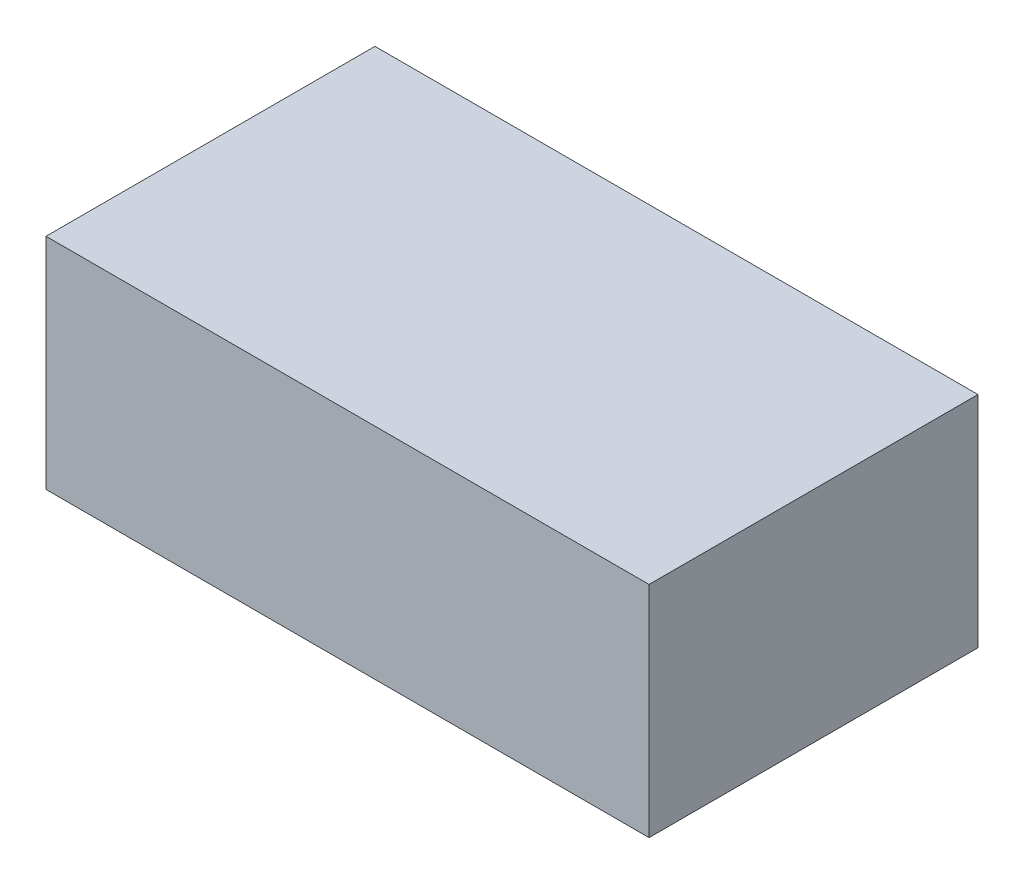
ISO-10303-21;
HEADER;
FILE_DESCRIPTION(('STEP AP214'),'2;1');
FILE_NAME('part.step','',(''),(''),'','','');
FILE_SCHEMA(('AUTOMOTIVE_DESIGN { 1 0 10303 214 1 1 1 1 }'));
ENDSEC;
DATA;
#1=APPLICATION_CONTEXT('core data for automotive mechanical design processes');
#2=APPLICATION_PROTOCOL_DEFINITION('international standard','automotive_design',2000,#1);
#3=PRODUCT_CONTEXT('',#1,'mechanical');
#4=PRODUCT('Part','Part','',(#3));
#5=PRODUCT_RELATED_PRODUCT_CATEGORY('part','',(#4));
#6=PRODUCT_DEFINITION_FORMATION('','',#4);
#7=PRODUCT_DEFINITION_CONTEXT('part definition',#1,'design');
#8=PRODUCT_DEFINITION('design','',#6,#7);
#9=PRODUCT_DEFINITION_SHAPE('','',#8);
#10=(LENGTH_UNIT() NAMED_UNIT(*) SI_UNIT(.MILLI.,.METRE.));
#11=(NAMED_UNIT(*) PLANE_ANGLE_UNIT() SI_UNIT($,.RADIAN.));
#12=(NAMED_UNIT(*) SI_UNIT($,.STERADIAN.) SOLID_ANGLE_UNIT());
#13=UNCERTAINTY_MEASURE_WITH_UNIT(LENGTH_MEASURE(1.E-05),#10,'distance_accuracy_value','');
#14=(GEOMETRIC_REPRESENTATION_CONTEXT(3) GLOBAL_UNCERTAINTY_ASSIGNED_CONTEXT((#13)) GLOBAL_UNIT_ASSIGNED_CONTEXT((#10,
#11,#12)) REPRESENTATION_CONTEXT('',''));
#15=CARTESIAN_POINT('',(0.,0.,0.));
#16=DIRECTION('',(0.,0.,1.));
#17=DIRECTION('',(1.,0.,0.));
#18=AXIS2_PLACEMENT_3D('',#15,#16,#17);
#19=CARTESIAN_POINT('',(275.,0.,0.));
#20=DIRECTION('',(0.,0.,1.));
#21=DIRECTION('',(1.,0.,0.));
#22=AXIS2_PLACEMENT_3D('',#19,#20,#21);
#23=PLANE('',#22);
#24=DIRECTION('',(0.,1.,0.));
#25=VECTOR('',#24,1.);
#26=CARTESIAN_POINT('',(0.,0.,0.));
#27=LINE('',#26,#25);
#28=CARTESIAN_POINT('',(0.,0.,0.));
#29=VERTEX_POINT('',#28);
#30=CARTESIAN_POINT('',(0.,100.,0.));
#31=VERTEX_POINT('',#30);
#32=EDGE_CURVE('E99',#29,#31,#27,.T.);
#33=ORIENTED_EDGE('',*,*,#32,.T.);
#34=DIRECTION('',(-1.,0.,0.));
#35=VECTOR('',#34,1.);
#36=CARTESIAN_POINT('',(275.,100.,0.));
#37=LINE('',#36,#35);
#38=CARTESIAN_POINT('',(275.,100.,0.));
#39=VERTEX_POINT('',#38);
#40=EDGE_CURVE('E11',#39,#31,#37,.T.);
#41=ORIENTED_EDGE('',*,*,#40,.F.);
#42=DIRECTION('',(0.,1.,0.));
#43=VECTOR('',#42,1.);
#44=CARTESIAN_POINT('',(275.,0.,0.));
#45=LINE('',#44,#43);
#46=CARTESIAN_POINT('',(275.,0.,0.));
#47=VERTEX_POINT('',#46);
#48=EDGE_CURVE('E87',#47,#39,#45,.T.);
#49=ORIENTED_EDGE('',*,*,#48,.F.);
#50=DIRECTION('',(-1.,0.,0.));
#51=VECTOR('',#50,1.);
#52=CARTESIAN_POINT('',(275.,0.,0.));
#53=LINE('',#52,#51);
#54=EDGE_CURVE('E95',#47,#29,#53,.T.);
#55=ORIENTED_EDGE('',*,*,#54,.T.);
#56=EDGE_LOOP('',(#33,#41,#49,#55));
#57=FACE_BOUND('',#56,.T.);
#58=ADVANCED_FACE('F36',(#57),#23,.F.);
#59=CARTESIAN_POINT('',(275.,100.,0.));
#60=DIRECTION('',(0.,-1.,0.));
#61=DIRECTION('',(0.,0.,-1.));
#62=AXIS2_PLACEMENT_3D('',#59,#60,#61);
#63=PLANE('',#62);
#64=DIRECTION('',(0.,0.,1.));
#65=VECTOR('',#64,1.);
#66=CARTESIAN_POINT('',(0.,100.,0.));
#67=LINE('',#66,#65);
#68=CARTESIAN_POINT('',(0.,100.,150.));
#69=VERTEX_POINT('',#68);
#70=EDGE_CURVE('E91',#31,#69,#67,.T.);
#71=ORIENTED_EDGE('',*,*,#70,.T.);
#72=DIRECTION('',(-1.,0.,0.));
#73=VECTOR('',#72,1.);
#74=CARTESIAN_POINT('',(275.,100.,150.));
#75=LINE('',#74,#73);
#76=CARTESIAN_POINT('',(275.,100.,150.));
#77=VERTEX_POINT('',#76);
#78=EDGE_CURVE('E44',#77,#69,#75,.T.);
#79=ORIENTED_EDGE('',*,*,#78,.F.);
#80=DIRECTION('',(0.,0.,1.));
#81=VECTOR('',#80,1.);
#82=CARTESIAN_POINT('',(275.,100.,0.));
#83=LINE('',#82,#81);
#84=EDGE_CURVE('E82',#39,#77,#83,.T.);
#85=ORIENTED_EDGE('',*,*,#84,.F.);
#86=ORIENTED_EDGE('',*,*,#40,.T.);
#87=EDGE_LOOP('',(#71,#79,#85,#86));
#88=FACE_BOUND('',#87,.T.);
#89=ADVANCED_FACE('F90',(#88),#63,.F.);
#90=CARTESIAN_POINT('',(275.,0.,150.));
#91=DIRECTION('',(0.,0.,-1.));
#92=DIRECTION('',(-1.,0.,0.));
#93=AXIS2_PLACEMENT_3D('',#90,#91,#92);
#94=PLANE('',#93);
#95=DIRECTION('',(0.,-1.,0.));
#96=VECTOR('',#95,1.);
#97=CARTESIAN_POINT('',(0.,0.,150.));
#98=LINE('',#97,#96);
#99=CARTESIAN_POINT('',(0.,0.,150.));
#100=VERTEX_POINT('',#99);
#101=EDGE_CURVE('E69',#69,#100,#98,.T.);
#102=ORIENTED_EDGE('',*,*,#101,.T.);
#103=DIRECTION('',(-1.,0.,0.));
#104=VECTOR('',#103,1.);
#105=CARTESIAN_POINT('',(275.,0.,150.));
#106=LINE('',#105,#104);
#107=CARTESIAN_POINT('',(275.,0.,150.));
#108=VERTEX_POINT('',#107);
#109=EDGE_CURVE('E92',#108,#100,#106,.T.);
#110=ORIENTED_EDGE('',*,*,#109,.F.);
#111=DIRECTION('',(0.,-1.,0.));
#112=VECTOR('',#111,1.);
#113=CARTESIAN_POINT('',(275.,0.,150.));
#114=LINE('',#113,#112);
#115=EDGE_CURVE('E85',#77,#108,#114,.T.);
#116=ORIENTED_EDGE('',*,*,#115,.F.);
#117=ORIENTED_EDGE('',*,*,#78,.T.);
#118=EDGE_LOOP('',(#102,#110,#116,#117));
#119=FACE_BOUND('',#118,.T.);
#120=ADVANCED_FACE('F93',(#119),#94,.F.);
#121=CARTESIAN_POINT('',(275.,0.,0.));
#122=DIRECTION('',(0.,1.,0.));
#123=DIRECTION('',(0.,0.,1.));
#124=AXIS2_PLACEMENT_3D('',#121,#122,#123);
#125=PLANE('',#124);
#126=DIRECTION('',(0.,0.,-1.));
#127=VECTOR('',#126,1.);
#128=CARTESIAN_POINT('',(0.,0.,0.));
#129=LINE('',#128,#127);
#130=EDGE_CURVE('E75',#100,#29,#129,.T.);
#131=ORIENTED_EDGE('',*,*,#130,.T.);
#132=ORIENTED_EDGE('',*,*,#54,.F.);
#133=DIRECTION('',(0.,0.,-1.));
#134=VECTOR('',#133,1.);
#135=CARTESIAN_POINT('',(275.,0.,0.));
#136=LINE('',#135,#134);
#137=EDGE_CURVE('E52',#108,#47,#136,.T.);
#138=ORIENTED_EDGE('',*,*,#137,.F.);
#139=ORIENTED_EDGE('',*,*,#109,.T.);
#140=EDGE_LOOP('',(#131,#132,#138,#139));
#141=FACE_BOUND('',#140,.T.);
#142=ADVANCED_FACE('F107',(#141),#125,.F.);
#143=CARTESIAN_POINT('',(275.,0.,0.));
#144=DIRECTION('',(1.,0.,0.));
#145=DIRECTION('',(0.,0.,-1.));
#146=AXIS2_PLACEMENT_3D('',#143,#144,#145);
#147=PLANE('',#146);
#148=ORIENTED_EDGE('',*,*,#48,.T.);
#149=ORIENTED_EDGE('',*,*,#84,.T.);
#150=ORIENTED_EDGE('',*,*,#115,.T.);
#151=ORIENTED_EDGE('',*,*,#137,.T.);
#152=EDGE_LOOP('',(#148,#149,#150,#151));
#153=FACE_BOUND('',#152,.T.);
#154=ADVANCED_FACE('F83',(#153),#147,.T.);
#155=CARTESIAN_POINT('',(0.,0.,0.));
#156=DIRECTION('',(1.,0.,0.));
#157=DIRECTION('',(0.,0.,-1.));
#158=AXIS2_PLACEMENT_3D('',#155,#156,#157);
#159=PLANE('',#158);
#160=CARTESIAN_POINT('',(0.,50.,75.));
#161=DIRECTION('',(-1.,0.,0.));
#162=DIRECTION('',(0.,0.,1.));
#163=AXIS2_PLACEMENT_3D('',#160,#161,#162);
#164=CIRCLE('',#163,15.);
#165=CARTESIAN_POINT('',(0.,50.,90.));
#166=VERTEX_POINT('',#165);
#167=EDGE_CURVE('E113',#166,#166,#164,.T.);
#168=ORIENTED_EDGE('',*,*,#167,.F.);
#169=EDGE_LOOP('',(#168));
#170=FACE_BOUND('',#169,.T.);
#171=ORIENTED_EDGE('',*,*,#32,.F.);
#172=ORIENTED_EDGE('',*,*,#130,.F.);
#173=ORIENTED_EDGE('',*,*,#101,.F.);
#174=ORIENTED_EDGE('',*,*,#70,.F.);
#175=EDGE_LOOP('',(#171,#172,#173,#174));
#176=FACE_BOUND('',#175,.T.);
#177=ADVANCED_FACE('F110',(#170,#176),#159,.F.);
#178=CARTESIAN_POINT('',(5.,50.,75.));
#179=DIRECTION('',(-1.,0.,0.));
#180=DIRECTION('',(0.,0.,1.));
#181=AXIS2_PLACEMENT_3D('',#178,#179,#180);
#182=CYLINDRICAL_SURFACE('',#181,15.);
#183=CARTESIAN_POINT('',(5.,50.,75.));
#184=DIRECTION('',(-1.,0.,0.));
#185=DIRECTION('',(0.,0.,1.));
#186=AXIS2_PLACEMENT_3D('',#183,#184,#185);
#187=CIRCLE('',#186,15.);
#188=CARTESIAN_POINT('',(5.,50.,90.));
#189=VERTEX_POINT('',#188);
#190=EDGE_CURVE('E102',#189,#189,#187,.T.);
#191=ORIENTED_EDGE('',*,*,#190,.F.);
#192=EDGE_LOOP('',(#191));
#193=FACE_BOUND('',#192,.T.);
#194=ORIENTED_EDGE('',*,*,#167,.T.);
#195=EDGE_LOOP('',(#194));
#196=FACE_BOUND('',#195,.T.);
#197=ADVANCED_FACE('F180',(#193,#196),#182,.F.);
#198=CARTESIAN_POINT('',(5.,50.,75.));
#199=DIRECTION('',(-1.,0.,0.));
#200=DIRECTION('',(0.,0.,1.));
#201=AXIS2_PLACEMENT_3D('',#198,#199,#200);
#202=PLANE('',#201);
#203=ORIENTED_EDGE('',*,*,#190,.T.);
#204=EDGE_LOOP('',(#203));
#205=FACE_BOUND('',#204,.T.);
#206=ADVANCED_FACE('F177',(#205),#202,.T.);
#207=CLOSED_SHELL('',(#58,#89,#120,#142,#154,#177,#197,#206));
#208=CARTESIAN_POINT('',(15.,50.,75.));
#209=DIRECTION('',(1.,0.,0.));
#210=DIRECTION('',(0.,0.,-1.));
#211=AXIS2_PLACEMENT_3D('',#208,#209,#210);
#212=PLANE('',#211);
#213=CARTESIAN_POINT('',(15.,50.,75.));
#214=DIRECTION('',(1.,0.,0.));
#215=DIRECTION('',(0.,0.,-1.));
#216=AXIS2_PLACEMENT_3D('',#213,#214,#215);
#217=CIRCLE('',#216,15.);
#218=CARTESIAN_POINT('',(15.,50.,60.));
#219=VERTEX_POINT('',#218);
#220=EDGE_CURVE('E116',#219,#219,#217,.T.);
#221=ORIENTED_EDGE('',*,*,#220,.T.);
#222=EDGE_LOOP('',(#221));
#223=FACE_BOUND('',#222,.T.);
#224=ADVANCED_FACE('F172',(#223),#212,.T.);
#225=CARTESIAN_POINT('',(265.,50.,75.));
#226=DIRECTION('',(1.,0.,0.));
#227=DIRECTION('',(0.,0.,-1.));
#228=AXIS2_PLACEMENT_3D('',#225,#226,#227);
#229=CYLINDRICAL_SURFACE('',#228,15.);
#230=CARTESIAN_POINT('',(30.,50.,75.));
#231=DIRECTION('',(1.,0.,0.));
#232=DIRECTION('',(0.,0.,-1.));
#233=AXIS2_PLACEMENT_3D('',#230,#231,#232);
#234=CIRCLE('',#233,15.);
#235=CARTESIAN_POINT('',(30.,50.,60.));
#236=VERTEX_POINT('',#235);
#237=EDGE_CURVE('E121',#236,#236,#234,.T.);
#238=ORIENTED_EDGE('',*,*,#237,.T.);
#239=EDGE_LOOP('',(#238));
#240=FACE_BOUND('',#239,.T.);
#241=ORIENTED_EDGE('',*,*,#220,.F.);
#242=EDGE_LOOP('',(#241));
#243=FACE_BOUND('',#242,.T.);
#244=ADVANCED_FACE('F168',(#240,#243),#229,.F.);
#245=CARTESIAN_POINT('',(30.,35.,75.));
#246=DIRECTION('',(1.,0.,0.));
#247=DIRECTION('',(0.,0.,-1.));
#248=AXIS2_PLACEMENT_3D('',#245,#246,#247);
#249=PLANE('',#248);
#250=CARTESIAN_POINT('',(30.,50.,75.));
#251=DIRECTION('',(1.,0.,0.));
#252=DIRECTION('',(0.,0.,-1.));
#253=AXIS2_PLACEMENT_3D('',#250,#251,#252);
#254=CIRCLE('',#253,18.);
#255=CARTESIAN_POINT('',(30.,50.,57.));
#256=VERTEX_POINT('',#255);
#257=EDGE_CURVE('E124',#256,#256,#254,.T.);
#258=ORIENTED_EDGE('',*,*,#257,.T.);
#259=EDGE_LOOP('',(#258));
#260=FACE_BOUND('',#259,.T.);
#261=ORIENTED_EDGE('',*,*,#237,.F.);
#262=EDGE_LOOP('',(#261));
#263=FACE_BOUND('',#262,.T.);
#264=ADVANCED_FACE('F164',(#260,#263),#249,.T.);
#265=CARTESIAN_POINT('',(265.,50.,75.));
#266=DIRECTION('',(1.,0.,0.));
#267=DIRECTION('',(0.,0.,-1.));
#268=AXIS2_PLACEMENT_3D('',#265,#266,#267);
#269=CYLINDRICAL_SURFACE('',#268,18.);
#270=CARTESIAN_POINT('',(31.5,50.,75.));
#271=DIRECTION('',(1.,0.,0.));
#272=DIRECTION('',(0.,0.,-1.));
#273=AXIS2_PLACEMENT_3D('',#270,#271,#272);
#274=CIRCLE('',#273,18.);
#275=CARTESIAN_POINT('',(31.5,50.,57.));
#276=VERTEX_POINT('',#275);
#277=EDGE_CURVE('E127',#276,#276,#274,.T.);
#278=ORIENTED_EDGE('',*,*,#277,.T.);
#279=EDGE_LOOP('',(#278));
#280=FACE_BOUND('',#279,.T.);
#281=ORIENTED_EDGE('',*,*,#257,.F.);
#282=EDGE_LOOP('',(#281));
#283=FACE_BOUND('',#282,.T.);
#284=ADVANCED_FACE('F160',(#280,#283),#269,.F.);
#285=CARTESIAN_POINT('',(31.5,32.,75.));
#286=DIRECTION('',(-1.,0.,0.));
#287=DIRECTION('',(0.,0.,1.));
#288=AXIS2_PLACEMENT_3D('',#285,#286,#287);
#289=PLANE('',#288);
#290=CARTESIAN_POINT('',(31.5,50.,75.));
#291=DIRECTION('',(1.,0.,0.));
#292=DIRECTION('',(0.,0.,-1.));
#293=AXIS2_PLACEMENT_3D('',#290,#291,#292);
#294=CIRCLE('',#293,15.);
#295=CARTESIAN_POINT('',(31.5,50.,60.));
#296=VERTEX_POINT('',#295);
#297=EDGE_CURVE('E130',#296,#296,#294,.T.);
#298=ORIENTED_EDGE('',*,*,#297,.T.);
#299=EDGE_LOOP('',(#298));
#300=FACE_BOUND('',#299,.T.);
#301=ORIENTED_EDGE('',*,*,#277,.F.);
#302=EDGE_LOOP('',(#301));
#303=FACE_BOUND('',#302,.T.);
#304=ADVANCED_FACE('F156',(#300,#303),#289,.T.);
#305=CARTESIAN_POINT('',(265.,50.,75.));
#306=DIRECTION('',(1.,0.,0.));
#307=DIRECTION('',(0.,0.,-1.));
#308=AXIS2_PLACEMENT_3D('',#305,#306,#307);
#309=CYLINDRICAL_SURFACE('',#308,15.);
#310=CARTESIAN_POINT('',(37.7168503483867,50.,75.));
#311=DIRECTION('',(1.,0.,0.));
#312=DIRECTION('',(0.,0.,-1.));
#313=AXIS2_PLACEMENT_3D('',#310,#311,#312);
#314=CIRCLE('',#313,15.);
#315=CARTESIAN_POINT('',(37.7168503483867,50.,60.));
#316=VERTEX_POINT('',#315);
#317=EDGE_CURVE('E133',#316,#316,#314,.T.);
#318=ORIENTED_EDGE('',*,*,#317,.T.);
#319=EDGE_LOOP('',(#318));
#320=FACE_BOUND('',#319,.T.);
#321=ORIENTED_EDGE('',*,*,#297,.F.);
#322=EDGE_LOOP('',(#321));
#323=FACE_BOUND('',#322,.T.);
#324=ADVANCED_FACE('F151',(#320,#323),#309,.F.);
#325=CARTESIAN_POINT('',(37.7168503483867,35.,75.));
#326=CARTESIAN_POINT('',(45.694579115025,33.7220132854283,75.));
#327=CARTESIAN_POINT('',(58.7390830714639,30.5106556740676,75.));
#328=CARTESIAN_POINT('',(70.6767796994929,17.3156514354436,75.));
#329=CARTESIAN_POINT('',(88.2977191763622,11.4527243782797,75.));
#330=CARTESIAN_POINT('',(112.135382589847,10.8373377456092,75.));
#331=CARTESIAN_POINT('',(137.537350145619,16.4384285237729,75.));
#332=CARTESIAN_POINT('',(170.022049953766,19.0092785072795,75.));
#333=CARTESIAN_POINT('',(210.136632414799,1.75833536251918,75.));
#334=CARTESIAN_POINT('',(247.01033665303,5.4429928066369,75.));
#335=CARTESIAN_POINT('',(265.,15.,75.));
#336=B_SPLINE_CURVE_WITH_KNOTS('',3,(#325,#326,#327,#328,#329,#330,#331,#332,#333,#334,#335),
.UNSPECIFIED.,.F.,.F.,(4,1,1,1,1,1,1,1,4),(0.,0.105527686602757,0.159807734462715,
0.221005565074455,0.33501010215689,0.459707985269627,0.55219215435714,0.743984646680737,1.),.UNSPECIFIED.);
#337=CARTESIAN_POINT('',(265.,50.,75.));
#338=DIRECTION('',(1.,0.,0.));
#339=AXIS1_PLACEMENT('',#337,#338);
#340=SURFACE_OF_REVOLUTION('',#336,#339);
#341=CARTESIAN_POINT('',(265.,50.,75.));
#342=DIRECTION('',(1.,0.,0.));
#343=DIRECTION('',(0.,0.,-1.));
#344=AXIS2_PLACEMENT_3D('',#341,#342,#343);
#345=CIRCLE('',#344,35.);
#346=CARTESIAN_POINT('',(265.,50.,40.));
#347=VERTEX_POINT('',#346);
#348=EDGE_CURVE('E136',#347,#347,#345,.T.);
#349=ORIENTED_EDGE('',*,*,#348,.T.);
#350=EDGE_LOOP('',(#349));
#351=FACE_BOUND('',#350,.T.);
#352=ORIENTED_EDGE('',*,*,#317,.F.);
#353=EDGE_LOOP('',(#352));
#354=FACE_BOUND('',#353,.T.);
#355=ADVANCED_FACE('F146',(#351,#354),#340,.F.);
#356=CARTESIAN_POINT('',(265.,15.,75.));
#357=DIRECTION('',(-1.,0.,0.));
#358=DIRECTION('',(0.,0.,1.));
#359=AXIS2_PLACEMENT_3D('',#356,#357,#358);
#360=PLANE('',#359);
#361=ORIENTED_EDGE('',*,*,#348,.F.);
#362=EDGE_LOOP('',(#361));
#363=FACE_BOUND('',#362,.T.);
#364=ADVANCED_FACE('F150',(#363),#360,.T.);
#365=CLOSED_SHELL('',(#224,#244,#264,#284,#304,#324,#355,#364));
#366=ORIENTED_CLOSED_SHELL('',*,#365,.T.);
#367=BREP_WITH_VOIDS('B2',#207,(#366));
#368=ADVANCED_BREP_SHAPE_REPRESENTATION('',(#18,#367),#14);
#369=SHAPE_DEFINITION_REPRESENTATION(#9,#368);
ENDSEC;
END-ISO-10303-21;
